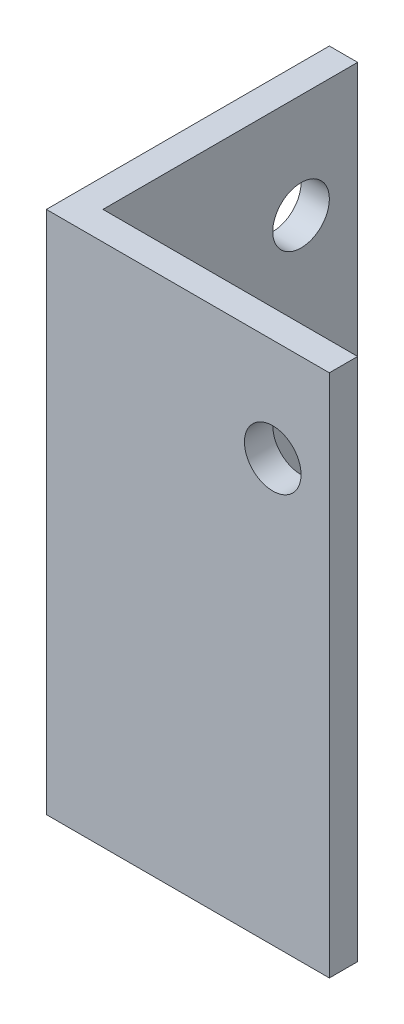
ISO-10303-21;
HEADER;
FILE_DESCRIPTION(('STEP AP214'),'2;1');
FILE_NAME('part.step','',(''),(''),'','','');
FILE_SCHEMA(('AUTOMOTIVE_DESIGN { 1 0 10303 214 1 1 1 1 }'));
ENDSEC;
DATA;
#1=APPLICATION_CONTEXT('core data for automotive mechanical design processes');
#2=APPLICATION_PROTOCOL_DEFINITION('international standard','automotive_design',2000,#1);
#3=PRODUCT_CONTEXT('',#1,'mechanical');
#4=PRODUCT('Part','Part','',(#3));
#5=PRODUCT_RELATED_PRODUCT_CATEGORY('part','',(#4));
#6=PRODUCT_DEFINITION_FORMATION('','',#4);
#7=PRODUCT_DEFINITION_CONTEXT('part definition',#1,'design');
#8=PRODUCT_DEFINITION('design','',#6,#7);
#9=PRODUCT_DEFINITION_SHAPE('','',#8);
#10=(LENGTH_UNIT() NAMED_UNIT(*) SI_UNIT(.MILLI.,.METRE.));
#11=(NAMED_UNIT(*) PLANE_ANGLE_UNIT() SI_UNIT($,.RADIAN.));
#12=(NAMED_UNIT(*) SI_UNIT($,.STERADIAN.) SOLID_ANGLE_UNIT());
#13=UNCERTAINTY_MEASURE_WITH_UNIT(LENGTH_MEASURE(1.E-05),#10,'distance_accuracy_value','');
#14=(GEOMETRIC_REPRESENTATION_CONTEXT(3) GLOBAL_UNCERTAINTY_ASSIGNED_CONTEXT((#13)) GLOBAL_UNIT_ASSIGNED_CONTEXT((#10,
#11,#12)) REPRESENTATION_CONTEXT('',''));
#15=CARTESIAN_POINT('',(0.,0.,0.));
#16=DIRECTION('',(0.,0.,1.));
#17=DIRECTION('',(1.,0.,0.));
#18=AXIS2_PLACEMENT_3D('',#15,#16,#17);
#19=CARTESIAN_POINT('',(10.,21.,0.));
#20=DIRECTION('',(0.,0.,-1.));
#21=DIRECTION('',(-1.,0.,0.));
#22=AXIS2_PLACEMENT_3D('',#19,#20,#21);
#23=PLANE('',#22);
#24=CARTESIAN_POINT('',(8.,17.3819712111225,0.));
#25=DIRECTION('',(0.,0.,-1.));
#26=DIRECTION('',(-1.,0.,0.));
#27=AXIS2_PLACEMENT_3D('',#24,#25,#26);
#28=CIRCLE('',#27,1.);
#29=CARTESIAN_POINT('',(7.,17.3819712111225,0.));
#30=VERTEX_POINT('',#29);
#31=EDGE_CURVE('E130',#30,#30,#28,.T.);
#32=ORIENTED_EDGE('',*,*,#31,.T.);
#33=EDGE_LOOP('',(#32));
#34=FACE_BOUND('',#33,.T.);
#35=DIRECTION('',(0.,-1.,0.));
#36=VECTOR('',#35,1.);
#37=CARTESIAN_POINT('',(0.,21.,0.));
#38=LINE('',#37,#36);
#39=CARTESIAN_POINT('',(0.,21.,0.));
#40=VERTEX_POINT('',#39);
#41=CARTESIAN_POINT('',(0.,2.48000000000001,0.));
#42=VERTEX_POINT('',#41);
#43=EDGE_CURVE('E103',#40,#42,#38,.T.);
#44=ORIENTED_EDGE('',*,*,#43,.T.);
#45=DIRECTION('',(-1.,0.,0.));
#46=VECTOR('',#45,1.);
#47=CARTESIAN_POINT('',(0.,2.48,0.));
#48=LINE('',#47,#46);
#49=CARTESIAN_POINT('',(10.,2.48,0.));
#50=VERTEX_POINT('',#49);
#51=EDGE_CURVE('E47',#50,#42,#48,.T.);
#52=ORIENTED_EDGE('',*,*,#51,.F.);
#53=DIRECTION('',(0.,-1.,0.));
#54=VECTOR('',#53,1.);
#55=CARTESIAN_POINT('',(10.,21.,0.));
#56=LINE('',#55,#54);
#57=CARTESIAN_POINT('',(10.,21.,0.));
#58=VERTEX_POINT('',#57);
#59=EDGE_CURVE('E11',#58,#50,#56,.T.);
#60=ORIENTED_EDGE('',*,*,#59,.F.);
#61=DIRECTION('',(1.,0.,0.));
#62=VECTOR('',#61,1.);
#63=CARTESIAN_POINT('',(10.,21.,0.));
#64=LINE('',#63,#62);
#65=EDGE_CURVE('E137',#40,#58,#64,.T.);
#66=ORIENTED_EDGE('',*,*,#65,.F.);
#67=EDGE_LOOP('',(#44,#52,#60,#66));
#68=FACE_BOUND('',#67,.T.);
#69=ADVANCED_FACE('F32',(#34,#68),#23,.F.);
#70=CARTESIAN_POINT('',(10.,21.,-1.));
#71=DIRECTION('',(-1.,0.,0.));
#72=DIRECTION('',(0.,0.,1.));
#73=AXIS2_PLACEMENT_3D('',#70,#71,#72);
#74=PLANE('',#73);
#75=ORIENTED_EDGE('',*,*,#59,.T.);
#76=DIRECTION('',(0.,0.,1.));
#77=VECTOR('',#76,1.);
#78=CARTESIAN_POINT('',(10.,2.48,0.));
#79=LINE('',#78,#77);
#80=CARTESIAN_POINT('',(10.,2.48,-1.));
#81=VERTEX_POINT('',#80);
#82=EDGE_CURVE('E125',#81,#50,#79,.T.);
#83=ORIENTED_EDGE('',*,*,#82,.F.);
#84=DIRECTION('',(0.,-1.,0.));
#85=VECTOR('',#84,1.);
#86=CARTESIAN_POINT('',(10.,21.,-1.));
#87=LINE('',#86,#85);
#88=CARTESIAN_POINT('',(10.,21.,-1.));
#89=VERTEX_POINT('',#88);
#90=EDGE_CURVE('E40',#89,#81,#87,.T.);
#91=ORIENTED_EDGE('',*,*,#90,.F.);
#92=DIRECTION('',(0.,0.,-1.));
#93=VECTOR('',#92,1.);
#94=CARTESIAN_POINT('',(10.,21.,-1.));
#95=LINE('',#94,#93);
#96=EDGE_CURVE('E124',#58,#89,#95,.T.);
#97=ORIENTED_EDGE('',*,*,#96,.F.);
#98=EDGE_LOOP('',(#75,#83,#91,#97));
#99=FACE_BOUND('',#98,.T.);
#100=ADVANCED_FACE('F123',(#99),#74,.F.);
#101=CARTESIAN_POINT('',(1.,21.,-1.));
#102=DIRECTION('',(0.,0.,1.));
#103=DIRECTION('',(1.,0.,0.));
#104=AXIS2_PLACEMENT_3D('',#101,#102,#103);
#105=PLANE('',#104);
#106=CARTESIAN_POINT('',(8.,17.3819712111225,-1.));
#107=DIRECTION('',(0.,0.,-1.));
#108=DIRECTION('',(-1.,0.,0.));
#109=AXIS2_PLACEMENT_3D('',#106,#107,#108);
#110=CIRCLE('',#109,1.);
#111=CARTESIAN_POINT('',(7.,17.3819712111225,-1.));
#112=VERTEX_POINT('',#111);
#113=EDGE_CURVE('E127',#112,#112,#110,.T.);
#114=ORIENTED_EDGE('',*,*,#113,.F.);
#115=EDGE_LOOP('',(#114));
#116=FACE_BOUND('',#115,.T.);
#117=ORIENTED_EDGE('',*,*,#90,.T.);
#118=DIRECTION('',(1.,0.,0.));
#119=VECTOR('',#118,1.);
#120=CARTESIAN_POINT('',(10.,2.48,-1.));
#121=LINE('',#120,#119);
#122=CARTESIAN_POINT('',(1.,2.48,-1.));
#123=VERTEX_POINT('',#122);
#124=EDGE_CURVE('E119',#123,#81,#121,.T.);
#125=ORIENTED_EDGE('',*,*,#124,.F.);
#126=DIRECTION('',(0.,-1.,0.));
#127=VECTOR('',#126,1.);
#128=CARTESIAN_POINT('',(1.,21.,-1.));
#129=LINE('',#128,#127);
#130=CARTESIAN_POINT('',(1.,21.,-1.));
#131=VERTEX_POINT('',#130);
#132=EDGE_CURVE('E105',#131,#123,#129,.T.);
#133=ORIENTED_EDGE('',*,*,#132,.F.);
#134=DIRECTION('',(-1.,0.,0.));
#135=VECTOR('',#134,1.);
#136=CARTESIAN_POINT('',(1.,21.,-1.));
#137=LINE('',#136,#135);
#138=EDGE_CURVE('E120',#89,#131,#137,.T.);
#139=ORIENTED_EDGE('',*,*,#138,.F.);
#140=EDGE_LOOP('',(#117,#125,#133,#139));
#141=FACE_BOUND('',#140,.T.);
#142=ADVANCED_FACE('F117',(#116,#141),#105,.F.);
#143=CARTESIAN_POINT('',(1.,21.,-10.));
#144=DIRECTION('',(-1.,0.,0.));
#145=DIRECTION('',(0.,0.,1.));
#146=AXIS2_PLACEMENT_3D('',#143,#144,#145);
#147=PLANE('',#146);
#148=CARTESIAN_POINT('',(1.,17.32,-8.));
#149=DIRECTION('',(1.,0.,0.));
#150=DIRECTION('',(0.,0.,-1.));
#151=AXIS2_PLACEMENT_3D('',#148,#149,#150);
#152=CIRCLE('',#151,1.);
#153=CARTESIAN_POINT('',(0.999999999999999,17.32,-9.));
#154=VERTEX_POINT('',#153);
#155=EDGE_CURVE('E150',#154,#154,#152,.T.);
#156=ORIENTED_EDGE('',*,*,#155,.F.);
#157=EDGE_LOOP('',(#156));
#158=FACE_BOUND('',#157,.T.);
#159=ORIENTED_EDGE('',*,*,#132,.T.);
#160=DIRECTION('',(0.,0.,1.));
#161=VECTOR('',#160,1.);
#162=CARTESIAN_POINT('',(1.,2.48,-1.));
#163=LINE('',#162,#161);
#164=CARTESIAN_POINT('',(1.,2.48,-10.));
#165=VERTEX_POINT('',#164);
#166=EDGE_CURVE('E100',#165,#123,#163,.T.);
#167=ORIENTED_EDGE('',*,*,#166,.F.);
#168=DIRECTION('',(0.,-1.,0.));
#169=VECTOR('',#168,1.);
#170=CARTESIAN_POINT('',(1.,21.,-10.));
#171=LINE('',#170,#169);
#172=CARTESIAN_POINT('',(1.,21.,-10.));
#173=VERTEX_POINT('',#172);
#174=EDGE_CURVE('E99',#173,#165,#171,.T.);
#175=ORIENTED_EDGE('',*,*,#174,.F.);
#176=DIRECTION('',(0.,0.,-1.));
#177=VECTOR('',#176,1.);
#178=CARTESIAN_POINT('',(1.,21.,-10.));
#179=LINE('',#178,#177);
#180=EDGE_CURVE('E141',#131,#173,#179,.T.);
#181=ORIENTED_EDGE('',*,*,#180,.F.);
#182=EDGE_LOOP('',(#159,#167,#175,#181));
#183=FACE_BOUND('',#182,.T.);
#184=ADVANCED_FACE('F147',(#158,#183),#147,.F.);
#185=CARTESIAN_POINT('',(0.,21.,-10.));
#186=DIRECTION('',(0.,0.,1.));
#187=DIRECTION('',(1.,0.,0.));
#188=AXIS2_PLACEMENT_3D('',#185,#186,#187);
#189=PLANE('',#188);
#190=ORIENTED_EDGE('',*,*,#174,.T.);
#191=DIRECTION('',(1.,0.,0.));
#192=VECTOR('',#191,1.);
#193=CARTESIAN_POINT('',(1.,2.48,-10.));
#194=LINE('',#193,#192);
#195=CARTESIAN_POINT('',(0.,2.48,-10.));
#196=VERTEX_POINT('',#195);
#197=EDGE_CURVE('E86',#196,#165,#194,.T.);
#198=ORIENTED_EDGE('',*,*,#197,.F.);
#199=DIRECTION('',(0.,-1.,0.));
#200=VECTOR('',#199,1.);
#201=CARTESIAN_POINT('',(0.,21.,-10.));
#202=LINE('',#201,#200);
#203=CARTESIAN_POINT('',(0.,21.,-10.));
#204=VERTEX_POINT('',#203);
#205=EDGE_CURVE('E97',#204,#196,#202,.T.);
#206=ORIENTED_EDGE('',*,*,#205,.F.);
#207=DIRECTION('',(-1.,0.,0.));
#208=VECTOR('',#207,1.);
#209=CARTESIAN_POINT('',(0.,21.,-10.));
#210=LINE('',#209,#208);
#211=EDGE_CURVE('E143',#173,#204,#210,.T.);
#212=ORIENTED_EDGE('',*,*,#211,.F.);
#213=EDGE_LOOP('',(#190,#198,#206,#212));
#214=FACE_BOUND('',#213,.T.);
#215=ADVANCED_FACE('F95',(#214),#189,.F.);
#216=CARTESIAN_POINT('',(0.,21.,0.));
#217=DIRECTION('',(1.,0.,0.));
#218=DIRECTION('',(0.,0.,-1.));
#219=AXIS2_PLACEMENT_3D('',#216,#217,#218);
#220=PLANE('',#219);
#221=CARTESIAN_POINT('',(0.,17.32,-8.));
#222=DIRECTION('',(1.,0.,0.));
#223=DIRECTION('',(0.,0.,-1.));
#224=AXIS2_PLACEMENT_3D('',#221,#222,#223);
#225=CIRCLE('',#224,1.);
#226=CARTESIAN_POINT('',(0.,17.32,-9.));
#227=VERTEX_POINT('',#226);
#228=EDGE_CURVE('E35',#227,#227,#225,.T.);
#229=ORIENTED_EDGE('',*,*,#228,.T.);
#230=EDGE_LOOP('',(#229));
#231=FACE_BOUND('',#230,.T.);
#232=ORIENTED_EDGE('',*,*,#205,.T.);
#233=DIRECTION('',(0.,0.,-1.));
#234=VECTOR('',#233,1.);
#235=CARTESIAN_POINT('',(0.,2.48,-10.));
#236=LINE('',#235,#234);
#237=EDGE_CURVE('E83',#42,#196,#236,.T.);
#238=ORIENTED_EDGE('',*,*,#237,.F.);
#239=ORIENTED_EDGE('',*,*,#43,.F.);
#240=DIRECTION('',(0.,0.,1.));
#241=VECTOR('',#240,1.);
#242=CARTESIAN_POINT('',(0.,21.,0.));
#243=LINE('',#242,#241);
#244=EDGE_CURVE('E55',#204,#40,#243,.T.);
#245=ORIENTED_EDGE('',*,*,#244,.F.);
#246=EDGE_LOOP('',(#232,#238,#239,#245));
#247=FACE_BOUND('',#246,.T.);
#248=ADVANCED_FACE('F102',(#231,#247),#220,.F.);
#249=CARTESIAN_POINT('',(0.,21.,0.));
#250=DIRECTION('',(0.,-1.,0.));
#251=DIRECTION('',(0.,0.,-1.));
#252=AXIS2_PLACEMENT_3D('',#249,#250,#251);
#253=PLANE('',#252);
#254=ORIENTED_EDGE('',*,*,#65,.T.);
#255=ORIENTED_EDGE('',*,*,#96,.T.);
#256=ORIENTED_EDGE('',*,*,#138,.T.);
#257=ORIENTED_EDGE('',*,*,#180,.T.);
#258=ORIENTED_EDGE('',*,*,#211,.T.);
#259=ORIENTED_EDGE('',*,*,#244,.T.);
#260=EDGE_LOOP('',(#254,#255,#256,#257,#258,#259));
#261=FACE_BOUND('',#260,.T.);
#262=ADVANCED_FACE('F144',(#261),#253,.F.);
#263=CARTESIAN_POINT('',(8.,17.3819712111225,20.));
#264=DIRECTION('',(0.,0.,-1.));
#265=DIRECTION('',(-1.,0.,0.));
#266=AXIS2_PLACEMENT_3D('',#263,#264,#265);
#267=CYLINDRICAL_SURFACE('',#266,1.);
#268=CARTESIAN_POINT('',(7.,17.3819712111225,-1.));
#269=CARTESIAN_POINT('',(7.,17.3819712111225,-0.989583333333334));
#270=CARTESIAN_POINT('',(7.,17.3819712111225,-0.979166666666668));
#271=CARTESIAN_POINT('',(7.,17.3819712111225,-0.958333333333334));
#272=CARTESIAN_POINT('',(7.,17.3819712111225,-0.947916666666668));
#273=CARTESIAN_POINT('',(7.,17.3819712111225,-0.927083333333334));
#274=CARTESIAN_POINT('',(7.,17.3819712111225,-0.916666666666668));
#275=CARTESIAN_POINT('',(7.,17.3819712111225,-0.895833333333334));
#276=CARTESIAN_POINT('',(7.,17.3819712111225,-0.885416666666668));
#277=CARTESIAN_POINT('',(7.,17.3819712111225,-0.864583333333334));
#278=CARTESIAN_POINT('',(7.,17.3819712111225,-0.854166666666667));
#279=CARTESIAN_POINT('',(7.,17.3819712111225,-0.833333333333334));
#280=CARTESIAN_POINT('',(7.,17.3819712111225,-0.822916666666667));
#281=CARTESIAN_POINT('',(7.,17.3819712111225,-0.802083333333334));
#282=CARTESIAN_POINT('',(7.,17.3819712111225,-0.791666666666667));
#283=CARTESIAN_POINT('',(7.,17.3819712111225,-0.770833333333334));
#284=CARTESIAN_POINT('',(7.,17.3819712111225,-0.760416666666667));
#285=CARTESIAN_POINT('',(7.,17.3819712111225,-0.739583333333333));
#286=CARTESIAN_POINT('',(7.,17.3819712111225,-0.729166666666665));
#287=CARTESIAN_POINT('',(7.,17.3819712111225,-0.70833333333333));
#288=CARTESIAN_POINT('',(7.,17.3819712111225,-0.697916666666664));
#289=CARTESIAN_POINT('',(7.,17.3819712111225,-0.67708333333333));
#290=CARTESIAN_POINT('',(7.,17.3819712111225,-0.666666666666664));
#291=CARTESIAN_POINT('',(7.,17.3819712111225,-0.64583333333333));
#292=CARTESIAN_POINT('',(7.,17.3819712111225,-0.635416666666664));
#293=CARTESIAN_POINT('',(7.,17.3819712111225,-0.61458333333333));
#294=CARTESIAN_POINT('',(7.,17.3819712111225,-0.604166666666664));
#295=CARTESIAN_POINT('',(7.,17.3819712111225,-0.58333333333333));
#296=CARTESIAN_POINT('',(7.,17.3819712111225,-0.572916666666664));
#297=CARTESIAN_POINT('',(7.,17.3819712111225,-0.55208333333333));
#298=CARTESIAN_POINT('',(7.,17.3819712111225,-0.541666666666664));
#299=CARTESIAN_POINT('',(7.,17.3819712111225,-0.52083333333333));
#300=CARTESIAN_POINT('',(7.,17.3819712111225,-0.510416666666664));
#301=CARTESIAN_POINT('',(7.,17.3819712111225,-0.48958333333333));
#302=CARTESIAN_POINT('',(7.,17.3819712111225,-0.479166666666664));
#303=CARTESIAN_POINT('',(7.,17.3819712111225,-0.45833333333333));
#304=CARTESIAN_POINT('',(7.,17.3819712111225,-0.447916666666664));
#305=CARTESIAN_POINT('',(7.,17.3819712111225,-0.42708333333333));
#306=CARTESIAN_POINT('',(7.,17.3819712111225,-0.416666666666664));
#307=CARTESIAN_POINT('',(7.,17.3819712111225,-0.39583333333333));
#308=CARTESIAN_POINT('',(7.,17.3819712111225,-0.385416666666664));
#309=CARTESIAN_POINT('',(7.,17.3819712111225,-0.36458333333333));
#310=CARTESIAN_POINT('',(7.,17.3819712111225,-0.354166666666664));
#311=CARTESIAN_POINT('',(7.,17.3819712111225,-0.33333333333333));
#312=CARTESIAN_POINT('',(7.,17.3819712111225,-0.322916666666663));
#313=CARTESIAN_POINT('',(7.,17.3819712111225,-0.30208333333333));
#314=CARTESIAN_POINT('',(7.,17.3819712111225,-0.291666666666663));
#315=CARTESIAN_POINT('',(7.,17.3819712111225,-0.270833333333329));
#316=CARTESIAN_POINT('',(7.,17.3819712111225,-0.260416666666661));
#317=CARTESIAN_POINT('',(7.,17.3819712111225,-0.239583333333327));
#318=CARTESIAN_POINT('',(7.,17.3819712111225,-0.22916666666666));
#319=CARTESIAN_POINT('',(7.,17.3819712111225,-0.208333333333327));
#320=CARTESIAN_POINT('',(7.,17.3819712111225,-0.19791666666666));
#321=CARTESIAN_POINT('',(7.,17.3819712111225,-0.177083333333327));
#322=CARTESIAN_POINT('',(7.,17.3819712111225,-0.16666666666666));
#323=CARTESIAN_POINT('',(7.,17.3819712111225,-0.145833333333327));
#324=CARTESIAN_POINT('',(7.,17.3819712111225,-0.13541666666666));
#325=CARTESIAN_POINT('',(7.,17.3819712111225,-0.114583333333327));
#326=CARTESIAN_POINT('',(7.,17.3819712111225,-0.10416666666666));
#327=CARTESIAN_POINT('',(7.,17.3819712111225,-0.0833333333333265));
#328=CARTESIAN_POINT('',(7.,17.3819712111225,-0.0729166666666598));
#329=CARTESIAN_POINT('',(7.,17.3819712111225,-0.0520833333333264));
#330=CARTESIAN_POINT('',(7.,17.3819712111225,-0.0416666666666598));
#331=CARTESIAN_POINT('',(7.,17.3819712111225,-0.0208333333333264));
#332=CARTESIAN_POINT('',(7.,17.3819712111225,-0.0104166666666597));
#333=CARTESIAN_POINT('',(7.,17.3819712111225,0.));
#334=B_SPLINE_CURVE_WITH_KNOTS('',3,(#268,#269,#270,#271,#272,#273,#274,#275,#276,#277,#278,
#279,#280,#281,#282,#283,#284,#285,#286,#287,#288,#289,#290,#291,#292,#293,#294,#295,#296,#297,
#298,#299,#300,#301,#302,#303,#304,#305,#306,#307,#308,#309,#310,#311,#312,#313,#314,#315,#316,
#317,#318,#319,#320,#321,#322,#323,#324,#325,#326,#327,#328,#329,#330,#331,#332,#333),
.UNSPECIFIED.,.F.,.F.,(4,2,2,2,2,2,2,2,2,2,2,2,2,2,2,2,2,2,2,2,2,2,2,2,2,2,2,2,2,2,2,2,4),(0.,
0.03125,0.0625000000000001,0.0937500000000001,0.125,0.15625,0.1875,0.21875,0.25,
0.281250000000004,0.312500000000004,0.343750000000004,0.375000000000004,0.406250000000004,
0.437500000000004,0.468750000000004,0.500000000000004,0.531250000000004,0.562500000000004,
0.593750000000004,0.625000000000004,0.656250000000004,0.687500000000004,0.718750000000004,
0.750000000000008,0.781250000000008,0.812500000000008,0.843750000000008,0.875000000000008,
0.906250000000008,0.937500000000008,0.968750000000008,1.00000000000001),.UNSPECIFIED.);
#335=EDGE_CURVE('BSEAM164',#112,#30,#334,.T.);
#336=ORIENTED_EDGE('',*,*,#113,.T.);
#337=ORIENTED_EDGE('',*,*,#31,.F.);
#338=ORIENTED_EDGE('',*,*,#335,.T.);
#339=ORIENTED_EDGE('',*,*,#335,.F.);
#340=EDGE_LOOP('',(#336,#338,#337,#339));
#341=FACE_BOUND('',#340,.T.);
#342=ADVANCED_FACE('F164',(#341),#267,.F.);
#343=CARTESIAN_POINT('',(0.,2.48,0.));
#344=DIRECTION('',(0.,1.,0.));
#345=DIRECTION('',(0.,0.,1.));
#346=AXIS2_PLACEMENT_3D('',#343,#344,#345);
#347=PLANE('',#346);
#348=ORIENTED_EDGE('',*,*,#51,.T.);
#349=ORIENTED_EDGE('',*,*,#237,.T.);
#350=ORIENTED_EDGE('',*,*,#197,.T.);
#351=ORIENTED_EDGE('',*,*,#166,.T.);
#352=ORIENTED_EDGE('',*,*,#124,.T.);
#353=ORIENTED_EDGE('',*,*,#82,.T.);
#354=EDGE_LOOP('',(#348,#349,#350,#351,#352,#353));
#355=FACE_BOUND('',#354,.T.);
#356=ADVANCED_FACE('F85',(#355),#347,.F.);
#357=CARTESIAN_POINT('',(-1.48,17.32,-8.));
#358=DIRECTION('',(1.,0.,0.));
#359=DIRECTION('',(0.,0.,-1.));
#360=AXIS2_PLACEMENT_3D('',#357,#358,#359);
#361=CYLINDRICAL_SURFACE('',#360,1.);
#362=ORIENTED_EDGE('',*,*,#155,.T.);
#363=EDGE_LOOP('',(#362));
#364=FACE_BOUND('',#363,.T.);
#365=ORIENTED_EDGE('',*,*,#228,.F.);
#366=EDGE_LOOP('',(#365));
#367=FACE_BOUND('',#366,.T.);
#368=ADVANCED_FACE('F158',(#364,#367),#361,.F.);
#369=CLOSED_SHELL('',(#69,#100,#142,#184,#215,#248,#262,#342,#356,#368));
#370=MANIFOLD_SOLID_BREP('B2',#369);
#371=ADVANCED_BREP_SHAPE_REPRESENTATION('',(#18,#370),#14);
#372=SHAPE_DEFINITION_REPRESENTATION(#9,#371);
ENDSEC;
END-ISO-10303-21;
